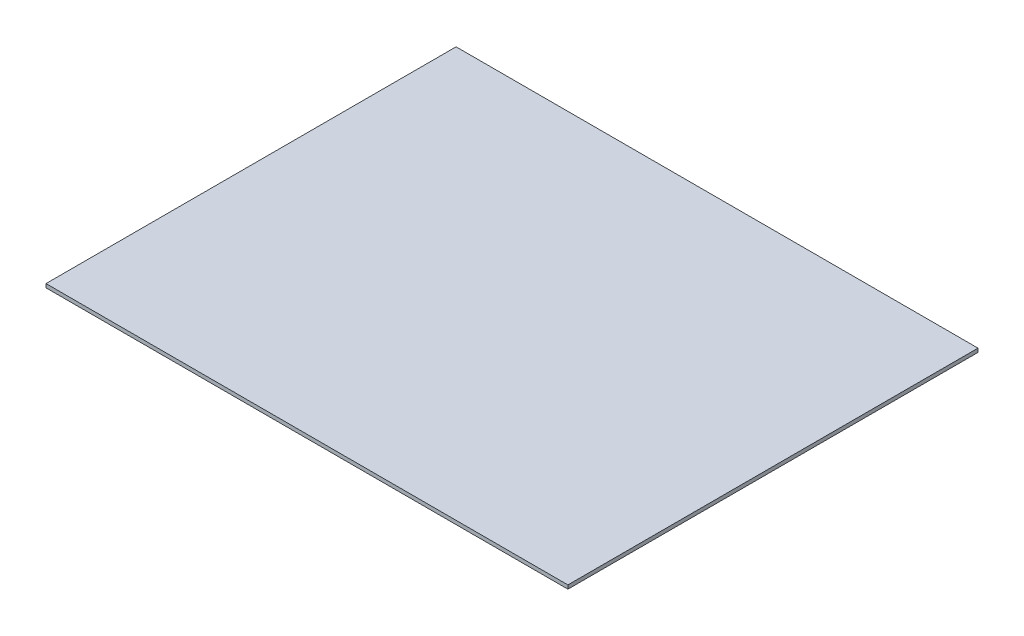
ISO-10303-21;
HEADER;
FILE_DESCRIPTION(('STEP AP214'),'2;1');
FILE_NAME('part.step','',(''),(''),'','','');
FILE_SCHEMA(('AUTOMOTIVE_DESIGN { 1 0 10303 214 1 1 1 1 }'));
ENDSEC;
DATA;
#1=APPLICATION_CONTEXT('core data for automotive mechanical design processes');
#2=APPLICATION_PROTOCOL_DEFINITION('international standard','automotive_design',2000,#1);
#3=PRODUCT_CONTEXT('',#1,'mechanical');
#4=PRODUCT('Part','Part','',(#3));
#5=PRODUCT_RELATED_PRODUCT_CATEGORY('part','',(#4));
#6=PRODUCT_DEFINITION_FORMATION('','',#4);
#7=PRODUCT_DEFINITION_CONTEXT('part definition',#1,'design');
#8=PRODUCT_DEFINITION('design','',#6,#7);
#9=PRODUCT_DEFINITION_SHAPE('','',#8);
#10=(LENGTH_UNIT() NAMED_UNIT(*) SI_UNIT(.MILLI.,.METRE.));
#11=(NAMED_UNIT(*) PLANE_ANGLE_UNIT() SI_UNIT($,.RADIAN.));
#12=(NAMED_UNIT(*) SI_UNIT($,.STERADIAN.) SOLID_ANGLE_UNIT());
#13=UNCERTAINTY_MEASURE_WITH_UNIT(LENGTH_MEASURE(1.E-05),#10,'distance_accuracy_value','');
#14=(GEOMETRIC_REPRESENTATION_CONTEXT(3) GLOBAL_UNCERTAINTY_ASSIGNED_CONTEXT((#13)) GLOBAL_UNIT_ASSIGNED_CONTEXT((#10,
#11,#12)) REPRESENTATION_CONTEXT('',''));
#15=CARTESIAN_POINT('',(0.,0.,0.));
#16=DIRECTION('',(0.,0.,1.));
#17=DIRECTION('',(1.,0.,0.));
#18=AXIS2_PLACEMENT_3D('',#15,#16,#17);
#19=CARTESIAN_POINT('',(0.,5.,0.));
#20=DIRECTION('',(-1.,0.,0.));
#21=DIRECTION('',(0.,0.,1.));
#22=AXIS2_PLACEMENT_3D('',#19,#20,#21);
#23=PLANE('',#22);
#24=DIRECTION('',(0.,0.,-1.));
#25=VECTOR('',#24,1.);
#26=CARTESIAN_POINT('',(0.,0.,0.));
#27=LINE('',#26,#25);
#28=CARTESIAN_POINT('',(0.,0.,550.));
#29=VERTEX_POINT('',#28);
#30=CARTESIAN_POINT('',(0.,0.,0.));
#31=VERTEX_POINT('',#30);
#32=EDGE_CURVE('E96',#29,#31,#27,.T.);
#33=ORIENTED_EDGE('',*,*,#32,.T.);
#34=DIRECTION('',(0.,-1.,0.));
#35=VECTOR('',#34,1.);
#36=CARTESIAN_POINT('',(0.,5.,0.));
#37=LINE('',#36,#35);
#38=CARTESIAN_POINT('',(0.,5.,0.));
#39=VERTEX_POINT('',#38);
#40=EDGE_CURVE('E11',#39,#31,#37,.T.);
#41=ORIENTED_EDGE('',*,*,#40,.F.);
#42=DIRECTION('',(0.,0.,-1.));
#43=VECTOR('',#42,1.);
#44=CARTESIAN_POINT('',(0.,5.,0.));
#45=LINE('',#44,#43);
#46=CARTESIAN_POINT('',(0.,5.,550.));
#47=VERTEX_POINT('',#46);
#48=EDGE_CURVE('E84',#47,#39,#45,.T.);
#49=ORIENTED_EDGE('',*,*,#48,.F.);
#50=DIRECTION('',(0.,-1.,0.));
#51=VECTOR('',#50,1.);
#52=CARTESIAN_POINT('',(0.,5.,550.));
#53=LINE('',#52,#51);
#54=EDGE_CURVE('E92',#47,#29,#53,.T.);
#55=ORIENTED_EDGE('',*,*,#54,.T.);
#56=EDGE_LOOP('',(#33,#41,#49,#55));
#57=FACE_BOUND('',#56,.T.);
#58=ADVANCED_FACE('F33',(#57),#23,.F.);
#59=CARTESIAN_POINT('',(0.,5.,0.));
#60=DIRECTION('',(0.,0.,1.));
#61=DIRECTION('',(1.,0.,0.));
#62=AXIS2_PLACEMENT_3D('',#59,#60,#61);
#63=PLANE('',#62);
#64=DIRECTION('',(-1.,0.,0.));
#65=VECTOR('',#64,1.);
#66=CARTESIAN_POINT('',(0.,0.,0.));
#67=LINE('',#66,#65);
#68=CARTESIAN_POINT('',(-700.,0.,0.));
#69=VERTEX_POINT('',#68);
#70=EDGE_CURVE('E88',#31,#69,#67,.T.);
#71=ORIENTED_EDGE('',*,*,#70,.T.);
#72=DIRECTION('',(0.,-1.,0.));
#73=VECTOR('',#72,1.);
#74=CARTESIAN_POINT('',(-700.,5.,0.));
#75=LINE('',#74,#73);
#76=CARTESIAN_POINT('',(-700.,5.,0.));
#77=VERTEX_POINT('',#76);
#78=EDGE_CURVE('E41',#77,#69,#75,.T.);
#79=ORIENTED_EDGE('',*,*,#78,.F.);
#80=DIRECTION('',(-1.,0.,0.));
#81=VECTOR('',#80,1.);
#82=CARTESIAN_POINT('',(0.,5.,0.));
#83=LINE('',#82,#81);
#84=EDGE_CURVE('E79',#39,#77,#83,.T.);
#85=ORIENTED_EDGE('',*,*,#84,.F.);
#86=ORIENTED_EDGE('',*,*,#40,.T.);
#87=EDGE_LOOP('',(#71,#79,#85,#86));
#88=FACE_BOUND('',#87,.T.);
#89=ADVANCED_FACE('F87',(#88),#63,.F.);
#90=CARTESIAN_POINT('',(-700.,5.,0.));
#91=DIRECTION('',(1.,0.,0.));
#92=DIRECTION('',(0.,0.,-1.));
#93=AXIS2_PLACEMENT_3D('',#90,#91,#92);
#94=PLANE('',#93);
#95=DIRECTION('',(0.,0.,1.));
#96=VECTOR('',#95,1.);
#97=CARTESIAN_POINT('',(-700.,0.,0.));
#98=LINE('',#97,#96);
#99=CARTESIAN_POINT('',(-700.,0.,550.));
#100=VERTEX_POINT('',#99);
#101=EDGE_CURVE('E66',#69,#100,#98,.T.);
#102=ORIENTED_EDGE('',*,*,#101,.T.);
#103=DIRECTION('',(0.,-1.,0.));
#104=VECTOR('',#103,1.);
#105=CARTESIAN_POINT('',(-700.,5.,550.));
#106=LINE('',#105,#104);
#107=CARTESIAN_POINT('',(-700.,5.,550.));
#108=VERTEX_POINT('',#107);
#109=EDGE_CURVE('E89',#108,#100,#106,.T.);
#110=ORIENTED_EDGE('',*,*,#109,.F.);
#111=DIRECTION('',(0.,0.,1.));
#112=VECTOR('',#111,1.);
#113=CARTESIAN_POINT('',(-700.,5.,0.));
#114=LINE('',#113,#112);
#115=EDGE_CURVE('E82',#77,#108,#114,.T.);
#116=ORIENTED_EDGE('',*,*,#115,.F.);
#117=ORIENTED_EDGE('',*,*,#78,.T.);
#118=EDGE_LOOP('',(#102,#110,#116,#117));
#119=FACE_BOUND('',#118,.T.);
#120=ADVANCED_FACE('F90',(#119),#94,.F.);
#121=CARTESIAN_POINT('',(0.,5.,550.));
#122=DIRECTION('',(0.,0.,-1.));
#123=DIRECTION('',(-1.,0.,0.));
#124=AXIS2_PLACEMENT_3D('',#121,#122,#123);
#125=PLANE('',#124);
#126=DIRECTION('',(1.,0.,0.));
#127=VECTOR('',#126,1.);
#128=CARTESIAN_POINT('',(0.,0.,550.));
#129=LINE('',#128,#127);
#130=EDGE_CURVE('E72',#100,#29,#129,.T.);
#131=ORIENTED_EDGE('',*,*,#130,.T.);
#132=ORIENTED_EDGE('',*,*,#54,.F.);
#133=DIRECTION('',(1.,0.,0.));
#134=VECTOR('',#133,1.);
#135=CARTESIAN_POINT('',(0.,5.,550.));
#136=LINE('',#135,#134);
#137=EDGE_CURVE('E49',#108,#47,#136,.T.);
#138=ORIENTED_EDGE('',*,*,#137,.F.);
#139=ORIENTED_EDGE('',*,*,#109,.T.);
#140=EDGE_LOOP('',(#131,#132,#138,#139));
#141=FACE_BOUND('',#140,.T.);
#142=ADVANCED_FACE('F103',(#141),#125,.F.);
#143=CARTESIAN_POINT('',(0.,5.,0.));
#144=DIRECTION('',(0.,-1.,0.));
#145=DIRECTION('',(0.,0.,-1.));
#146=AXIS2_PLACEMENT_3D('',#143,#144,#145);
#147=PLANE('',#146);
#148=ORIENTED_EDGE('',*,*,#48,.T.);
#149=ORIENTED_EDGE('',*,*,#84,.T.);
#150=ORIENTED_EDGE('',*,*,#115,.T.);
#151=ORIENTED_EDGE('',*,*,#137,.T.);
#152=EDGE_LOOP('',(#148,#149,#150,#151));
#153=FACE_BOUND('',#152,.T.);
#154=ADVANCED_FACE('F80',(#153),#147,.F.);
#155=CARTESIAN_POINT('',(0.,0.,0.));
#156=DIRECTION('',(0.,-1.,0.));
#157=DIRECTION('',(0.,0.,-1.));
#158=AXIS2_PLACEMENT_3D('',#155,#156,#157);
#159=PLANE('',#158);
#160=ORIENTED_EDGE('',*,*,#32,.F.);
#161=ORIENTED_EDGE('',*,*,#130,.F.);
#162=ORIENTED_EDGE('',*,*,#101,.F.);
#163=ORIENTED_EDGE('',*,*,#70,.F.);
#164=EDGE_LOOP('',(#160,#161,#162,#163));
#165=FACE_BOUND('',#164,.T.);
#166=ADVANCED_FACE('F106',(#165),#159,.T.);
#167=CLOSED_SHELL('',(#58,#89,#120,#142,#154,#166));
#168=MANIFOLD_SOLID_BREP('B2',#167);
#169=ADVANCED_BREP_SHAPE_REPRESENTATION('',(#18,#168),#14);
#170=SHAPE_DEFINITION_REPRESENTATION(#9,#169);
ENDSEC;
END-ISO-10303-21;
